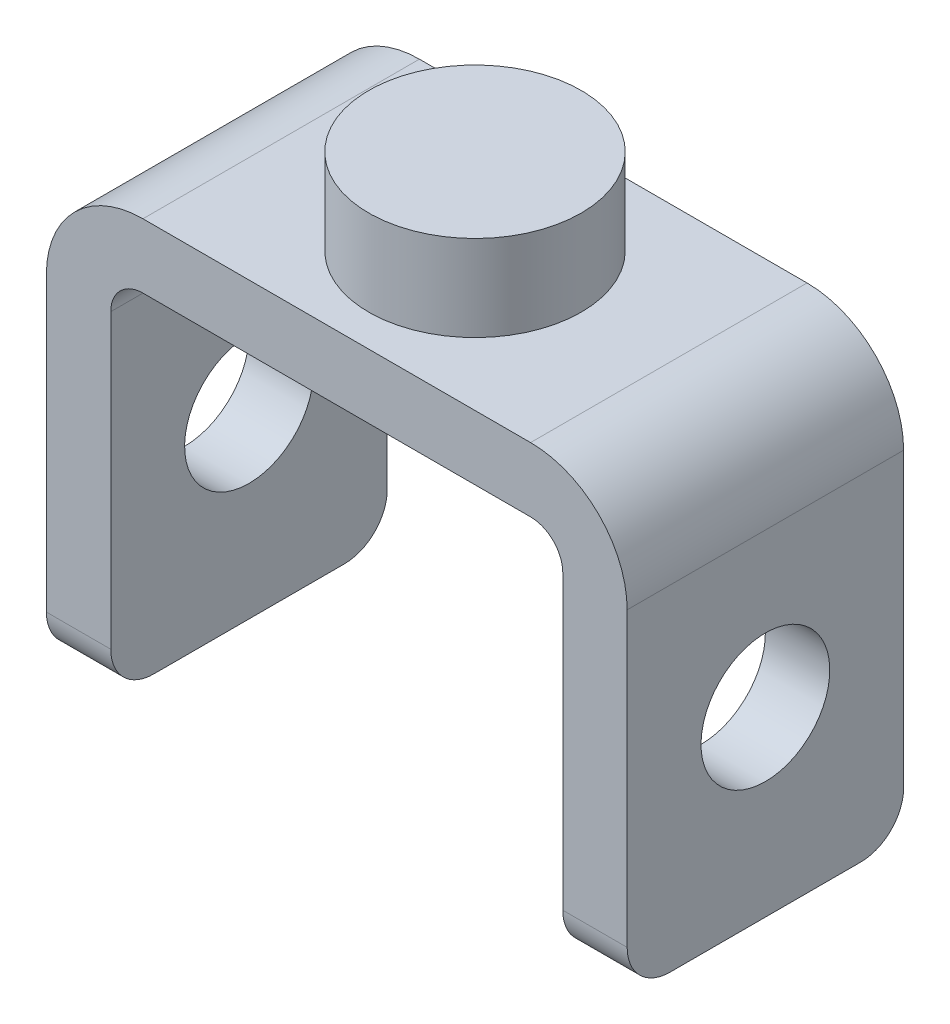
ISO-10303-21;
HEADER;
FILE_DESCRIPTION(('STEP AP214'),'2;1');
FILE_NAME('part.step','',(''),(''),'','','');
FILE_SCHEMA(('AUTOMOTIVE_DESIGN { 1 0 10303 214 1 1 1 1 }'));
ENDSEC;
DATA;
#1=APPLICATION_CONTEXT('core data for automotive mechanical design processes');
#2=APPLICATION_PROTOCOL_DEFINITION('international standard','automotive_design',2000,#1);
#3=PRODUCT_CONTEXT('',#1,'mechanical');
#4=PRODUCT('Part','Part','',(#3));
#5=PRODUCT_RELATED_PRODUCT_CATEGORY('part','',(#4));
#6=PRODUCT_DEFINITION_FORMATION('','',#4);
#7=PRODUCT_DEFINITION_CONTEXT('part definition',#1,'design');
#8=PRODUCT_DEFINITION('design','',#6,#7);
#9=PRODUCT_DEFINITION_SHAPE('','',#8);
#10=(LENGTH_UNIT() NAMED_UNIT(*) SI_UNIT(.MILLI.,.METRE.));
#11=(NAMED_UNIT(*) PLANE_ANGLE_UNIT() SI_UNIT($,.RADIAN.));
#12=(NAMED_UNIT(*) SI_UNIT($,.STERADIAN.) SOLID_ANGLE_UNIT());
#13=UNCERTAINTY_MEASURE_WITH_UNIT(LENGTH_MEASURE(1.E-05),#10,'distance_accuracy_value','');
#14=(GEOMETRIC_REPRESENTATION_CONTEXT(3) GLOBAL_UNCERTAINTY_ASSIGNED_CONTEXT((#13)) GLOBAL_UNIT_ASSIGNED_CONTEXT((#10,
#11,#12)) REPRESENTATION_CONTEXT('',''));
#15=CARTESIAN_POINT('',(0.,0.,0.));
#16=DIRECTION('',(0.,0.,1.));
#17=DIRECTION('',(1.,0.,0.));
#18=AXIS2_PLACEMENT_3D('',#15,#16,#17);
#19=CARTESIAN_POINT('',(689.030871634325,555.34088748101,-81.8077030001191));
#20=DIRECTION('',(0.,1.,0.));
#21=DIRECTION('',(0.,0.,1.));
#22=AXIS2_PLACEMENT_3D('',#19,#20,#21);
#23=PLANE('',#22);
#24=CARTESIAN_POINT('',(689.030871634325,555.34088748101,-81.8077030001191));
#25=DIRECTION('',(0.,-1.,0.));
#26=DIRECTION('',(1.,0.,0.));
#27=AXIS2_PLACEMENT_3D('',#24,#25,#26);
#28=CIRCLE('',#27,62.8792399580919);
#29=CARTESIAN_POINT('',(751.910111592417,555.34088748101,-81.8077030001191));
#30=VERTEX_POINT('',#29);
#31=EDGE_CURVE('E19',#30,#30,#28,.T.);
#32=ORIENTED_EDGE('',*,*,#31,.F.);
#33=EDGE_LOOP('',(#32));
#34=FACE_BOUND('',#33,.T.);
#35=ADVANCED_FACE('F16',(#34),#23,.T.);
#36=CARTESIAN_POINT('',(689.030871634325,555.34088748101,-81.8077030001191));
#37=DIRECTION('',(0.,-1.,0.));
#38=DIRECTION('',(1.,0.,0.));
#39=AXIS2_PLACEMENT_3D('',#36,#37,#38);
#40=CYLINDRICAL_SURFACE('',#39,62.8792399580919);
#41=ORIENTED_EDGE('',*,*,#31,.T.);
#42=EDGE_LOOP('',(#41));
#43=FACE_BOUND('',#42,.T.);
#44=CARTESIAN_POINT('',(689.030871634325,504.54088748101,-81.8077030001191));
#45=DIRECTION('',(0.,-1.,0.));
#46=DIRECTION('',(1.,0.,0.));
#47=AXIS2_PLACEMENT_3D('',#44,#45,#46);
#48=CIRCLE('',#47,62.8792399580919);
#49=CARTESIAN_POINT('',(751.910111592417,504.54088748101,-81.8077030001191));
#50=VERTEX_POINT('',#49);
#51=EDGE_CURVE('E218',#50,#50,#48,.T.);
#52=ORIENTED_EDGE('',*,*,#51,.F.);
#53=EDGE_LOOP('',(#52));
#54=FACE_BOUND('',#53,.T.);
#55=ADVANCED_FACE('F238',(#43,#54),#40,.T.);
#56=CARTESIAN_POINT('',(860.886693350958,356.550485023665,-81.8077030001191));
#57=DIRECTION('',(-1.,0.,0.));
#58=DIRECTION('',(0.,-1.,0.));
#59=AXIS2_PLACEMENT_3D('',#56,#57,#58);
#60=CYLINDRICAL_SURFACE('',#59,38.1);
#61=CARTESIAN_POINT('',(555.275049917692,356.550485023665,-81.8077030001191));
#62=DIRECTION('',(-1.,0.,0.));
#63=DIRECTION('',(0.,-1.,0.));
#64=AXIS2_PLACEMENT_3D('',#61,#62,#63);
#65=CIRCLE('',#64,38.1);
#66=CARTESIAN_POINT('',(555.275049917692,318.450485023665,-81.8077030001191));
#67=VERTEX_POINT('',#66);
#68=EDGE_CURVE('E137',#67,#67,#65,.T.);
#69=ORIENTED_EDGE('',*,*,#68,.F.);
#70=EDGE_LOOP('',(#69));
#71=FACE_BOUND('',#70,.T.);
#72=CARTESIAN_POINT('',(517.175049917692,356.550485023665,-81.8077030001191));
#73=DIRECTION('',(-1.,0.,0.));
#74=DIRECTION('',(0.,-1.,0.));
#75=AXIS2_PLACEMENT_3D('',#72,#73,#74);
#76=CIRCLE('',#75,38.1);
#77=CARTESIAN_POINT('',(517.175049917692,318.450485023665,-81.8077030001191));
#78=VERTEX_POINT('',#77);
#79=EDGE_CURVE('E211',#78,#78,#76,.F.);
#80=ORIENTED_EDGE('',*,*,#79,.F.);
#81=EDGE_LOOP('',(#80));
#82=FACE_BOUND('',#81,.T.);
#83=ADVANCED_FACE('F234',(#71,#82),#60,.F.);
#84=CARTESIAN_POINT('',(555.275049917692,248.988122651685,-163.615406000238));
#85=DIRECTION('',(0.,-1.,0.));
#86=DIRECTION('',(0.,0.,-1.));
#87=AXIS2_PLACEMENT_3D('',#84,#85,#86);
#88=PLANE('',#87);
#89=DIRECTION('',(-1.,0.,0.));
#90=VECTOR('',#89,1.);
#91=CARTESIAN_POINT('',(622.152960776008,248.988122651685,-25.4));
#92=LINE('',#91,#90);
#93=CARTESIAN_POINT('',(517.175049917692,248.988122651685,-25.4));
#94=VERTEX_POINT('',#93);
#95=CARTESIAN_POINT('',(555.275049917692,248.988122651685,-25.4));
#96=VERTEX_POINT('',#95);
#97=EDGE_CURVE('E133',#94,#96,#92,.F.);
#98=ORIENTED_EDGE('',*,*,#97,.F.);
#99=DIRECTION('',(0.,0.,1.));
#100=VECTOR('',#99,1.);
#101=CARTESIAN_POINT('',(517.175049917692,248.988122651685,-163.615406000238));
#102=LINE('',#101,#100);
#103=CARTESIAN_POINT('',(517.175049917692,248.988122651685,-138.215406000238));
#104=VERTEX_POINT('',#103);
#105=EDGE_CURVE('E217',#104,#94,#102,.T.);
#106=ORIENTED_EDGE('',*,*,#105,.F.);
#107=DIRECTION('',(1.,0.,0.));
#108=VECTOR('',#107,1.);
#109=CARTESIAN_POINT('',(622.152960776008,248.988122651685,-138.215406000238));
#110=LINE('',#109,#108);
#111=CARTESIAN_POINT('',(555.275049917692,248.988122651685,-138.215406000238));
#112=VERTEX_POINT('',#111);
#113=EDGE_CURVE('E171',#112,#104,#110,.F.);
#114=ORIENTED_EDGE('',*,*,#113,.F.);
#115=DIRECTION('',(0.,0.,-1.));
#116=VECTOR('',#115,1.);
#117=CARTESIAN_POINT('',(555.275049917692,248.988122651685,-163.615406000238));
#118=LINE('',#117,#116);
#119=EDGE_CURVE('E136',#96,#112,#118,.T.);
#120=ORIENTED_EDGE('',*,*,#119,.F.);
#121=EDGE_LOOP('',(#98,#106,#114,#120));
#122=FACE_BOUND('',#121,.T.);
#123=ADVANCED_FACE('F237',(#122),#88,.T.);
#124=CARTESIAN_POINT('',(860.886693350958,248.988122651685,-163.615406000238));
#125=DIRECTION('',(0.,-1.,0.));
#126=DIRECTION('',(0.,0.,-1.));
#127=AXIS2_PLACEMENT_3D('',#124,#125,#126);
#128=PLANE('',#127);
#129=DIRECTION('',(-1.,0.,0.));
#130=VECTOR('',#129,1.);
#131=CARTESIAN_POINT('',(774.958782492641,248.988122651685,-25.4));
#132=LINE('',#131,#130);
#133=CARTESIAN_POINT('',(822.786693350958,248.988122651685,-25.4));
#134=VERTEX_POINT('',#133);
#135=CARTESIAN_POINT('',(860.886693350958,248.988122651685,-25.4));
#136=VERTEX_POINT('',#135);
#137=EDGE_CURVE('E166',#134,#136,#132,.F.);
#138=ORIENTED_EDGE('',*,*,#137,.F.);
#139=DIRECTION('',(0.,0.,1.));
#140=VECTOR('',#139,1.);
#141=CARTESIAN_POINT('',(822.786693350958,248.988122651685,-163.615406000238));
#142=LINE('',#141,#140);
#143=CARTESIAN_POINT('',(822.786693350958,248.988122651685,-138.215406000238));
#144=VERTEX_POINT('',#143);
#145=EDGE_CURVE('E203',#144,#134,#142,.T.);
#146=ORIENTED_EDGE('',*,*,#145,.F.);
#147=DIRECTION('',(1.,0.,0.));
#148=VECTOR('',#147,1.);
#149=CARTESIAN_POINT('',(774.958782492641,248.988122651685,-138.215406000238));
#150=LINE('',#149,#148);
#151=CARTESIAN_POINT('',(860.886693350958,248.988122651685,-138.215406000238));
#152=VERTEX_POINT('',#151);
#153=EDGE_CURVE('E168',#152,#144,#150,.F.);
#154=ORIENTED_EDGE('',*,*,#153,.F.);
#155=DIRECTION('',(0.,0.,-1.));
#156=VECTOR('',#155,1.);
#157=CARTESIAN_POINT('',(860.886693350958,248.988122651685,-163.615406000238));
#158=LINE('',#157,#156);
#159=EDGE_CURVE('E226',#136,#152,#158,.T.);
#160=ORIENTED_EDGE('',*,*,#159,.F.);
#161=EDGE_LOOP('',(#138,#146,#154,#160));
#162=FACE_BOUND('',#161,.T.);
#163=ADVANCED_FACE('F360',(#162),#128,.T.);
#164=CARTESIAN_POINT('',(860.886693350958,356.550485023665,-81.8077030001191));
#165=DIRECTION('',(-1.,0.,0.));
#166=DIRECTION('',(0.,-1.,0.));
#167=AXIS2_PLACEMENT_3D('',#164,#165,#166);
#168=CYLINDRICAL_SURFACE('',#167,38.1);
#169=CARTESIAN_POINT('',(860.886693350958,356.550485023665,-81.8077030001191));
#170=DIRECTION('',(-1.,0.,0.));
#171=DIRECTION('',(0.,-1.,0.));
#172=AXIS2_PLACEMENT_3D('',#169,#170,#171);
#173=CIRCLE('',#172,38.1);
#174=CARTESIAN_POINT('',(860.886693350958,318.450485023665,-81.8077030001191));
#175=VERTEX_POINT('',#174);
#176=EDGE_CURVE('E170',#175,#175,#173,.T.);
#177=ORIENTED_EDGE('',*,*,#176,.F.);
#178=EDGE_LOOP('',(#177));
#179=FACE_BOUND('',#178,.T.);
#180=CARTESIAN_POINT('',(822.786693350958,356.550485023665,-81.8077030001191));
#181=DIRECTION('',(-1.,0.,0.));
#182=DIRECTION('',(0.,-1.,0.));
#183=AXIS2_PLACEMENT_3D('',#180,#181,#182);
#184=CIRCLE('',#183,38.1);
#185=CARTESIAN_POINT('',(822.786693350958,318.450485023665,-81.8077030001191));
#186=VERTEX_POINT('',#185);
#187=EDGE_CURVE('E154',#186,#186,#184,.F.);
#188=ORIENTED_EDGE('',*,*,#187,.F.);
#189=EDGE_LOOP('',(#188));
#190=FACE_BOUND('',#189,.T.);
#191=ADVANCED_FACE('F365',(#179,#190),#168,.F.);
#192=CARTESIAN_POINT('',(622.152960776008,274.388122651685,-25.4));
#193=DIRECTION('',(-1.,0.,0.));
#194=DIRECTION('',(0.,0.,1.));
#195=AXIS2_PLACEMENT_3D('',#192,#193,#194);
#196=CYLINDRICAL_SURFACE('',#195,25.4);
#197=CARTESIAN_POINT('',(555.275049917692,274.388122651685,-25.4));
#198=DIRECTION('',(-1.,0.,0.));
#199=DIRECTION('',(0.,0.,1.));
#200=AXIS2_PLACEMENT_3D('',#197,#198,#199);
#201=CIRCLE('',#200,25.4);
#202=CARTESIAN_POINT('',(555.275049917692,274.388122651685,0.));
#203=VERTEX_POINT('',#202);
#204=EDGE_CURVE('E126',#203,#96,#201,.F.);
#205=ORIENTED_EDGE('',*,*,#204,.F.);
#206=DIRECTION('',(1.,0.,0.));
#207=VECTOR('',#206,1.);
#208=CARTESIAN_POINT('',(689.030871634325,274.388122651685,0.));
#209=LINE('',#208,#207);
#210=CARTESIAN_POINT('',(517.175049917692,274.388122651685,0.));
#211=VERTEX_POINT('',#210);
#212=EDGE_CURVE('E131',#211,#203,#209,.T.);
#213=ORIENTED_EDGE('',*,*,#212,.F.);
#214=CARTESIAN_POINT('',(517.175049917692,274.388122651685,-25.4));
#215=DIRECTION('',(-1.,0.,0.));
#216=DIRECTION('',(0.,0.,1.));
#217=AXIS2_PLACEMENT_3D('',#214,#215,#216);
#218=CIRCLE('',#217,25.4);
#219=EDGE_CURVE('E215',#94,#211,#218,.T.);
#220=ORIENTED_EDGE('',*,*,#219,.F.);
#221=ORIENTED_EDGE('',*,*,#97,.T.);
#222=EDGE_LOOP('',(#205,#213,#220,#221));
#223=FACE_BOUND('',#222,.T.);
#224=ADVANCED_FACE('F128',(#223),#196,.T.);
#225=CARTESIAN_POINT('',(774.958782492641,274.388122651685,-25.4));
#226=DIRECTION('',(-1.,0.,0.));
#227=DIRECTION('',(0.,0.,1.));
#228=AXIS2_PLACEMENT_3D('',#225,#226,#227);
#229=CYLINDRICAL_SURFACE('',#228,25.4);
#230=CARTESIAN_POINT('',(822.786693350958,274.388122651685,-25.4));
#231=DIRECTION('',(-1.,0.,0.));
#232=DIRECTION('',(0.,0.,1.));
#233=AXIS2_PLACEMENT_3D('',#230,#231,#232);
#234=CIRCLE('',#233,25.4);
#235=CARTESIAN_POINT('',(822.786693350958,274.388122651685,0.));
#236=VERTEX_POINT('',#235);
#237=EDGE_CURVE('E157',#134,#236,#234,.T.);
#238=ORIENTED_EDGE('',*,*,#237,.F.);
#239=ORIENTED_EDGE('',*,*,#137,.T.);
#240=CARTESIAN_POINT('',(860.886693350958,274.388122651685,-25.4));
#241=DIRECTION('',(-1.,0.,0.));
#242=DIRECTION('',(0.,0.,1.));
#243=AXIS2_PLACEMENT_3D('',#240,#241,#242);
#244=CIRCLE('',#243,25.4);
#245=CARTESIAN_POINT('',(860.886693350958,274.388122651685,0.));
#246=VERTEX_POINT('',#245);
#247=EDGE_CURVE('E223',#246,#136,#244,.F.);
#248=ORIENTED_EDGE('',*,*,#247,.F.);
#249=DIRECTION('',(1.,0.,0.));
#250=VECTOR('',#249,1.);
#251=CARTESIAN_POINT('',(689.030871634325,274.388122651685,0.));
#252=LINE('',#251,#250);
#253=EDGE_CURVE('E162',#236,#246,#252,.T.);
#254=ORIENTED_EDGE('',*,*,#253,.F.);
#255=EDGE_LOOP('',(#238,#239,#248,#254));
#256=FACE_BOUND('',#255,.T.);
#257=ADVANCED_FACE('F316',(#256),#229,.T.);
#258=CARTESIAN_POINT('',(555.275049917692,447.39088748101,-163.615406000238));
#259=DIRECTION('',(1.,0.,0.));
#260=DIRECTION('',(0.,0.,-1.));
#261=AXIS2_PLACEMENT_3D('',#258,#259,#260);
#262=PLANE('',#261);
#263=ORIENTED_EDGE('',*,*,#204,.T.);
#264=ORIENTED_EDGE('',*,*,#119,.T.);
#265=CARTESIAN_POINT('',(555.275049917692,274.388122651685,-138.215406000238));
#266=DIRECTION('',(1.,0.,0.));
#267=DIRECTION('',(0.,0.,-1.));
#268=AXIS2_PLACEMENT_3D('',#265,#266,#267);
#269=CIRCLE('',#268,25.4);
#270=CARTESIAN_POINT('',(555.275049917692,274.388122651685,-163.615406000238));
#271=VERTEX_POINT('',#270);
#272=EDGE_CURVE('E175',#271,#112,#269,.F.);
#273=ORIENTED_EDGE('',*,*,#272,.F.);
#274=DIRECTION('',(0.,1.,0.));
#275=VECTOR('',#274,1.);
#276=CARTESIAN_POINT('',(555.275049917692,403.21964238776,-163.615406000238));
#277=LINE('',#276,#275);
#278=CARTESIAN_POINT('',(555.275049917692,447.39088748101,-163.615406000238));
#279=VERTEX_POINT('',#278);
#280=EDGE_CURVE('E193',#271,#279,#277,.T.);
#281=ORIENTED_EDGE('',*,*,#280,.T.);
#282=DIRECTION('',(0.,0.,1.));
#283=VECTOR('',#282,1.);
#284=CARTESIAN_POINT('',(555.275049917692,447.39088748101,-163.615406000238));
#285=LINE('',#284,#283);
#286=CARTESIAN_POINT('',(555.275049917692,447.39088748101,0.));
#287=VERTEX_POINT('',#286);
#288=EDGE_CURVE('E144',#287,#279,#285,.F.);
#289=ORIENTED_EDGE('',*,*,#288,.F.);
#290=DIRECTION('',(0.,1.,0.));
#291=VECTOR('',#290,1.);
#292=CARTESIAN_POINT('',(555.275049917692,403.21964238776,0.));
#293=LINE('',#292,#291);
#294=EDGE_CURVE('E140',#203,#287,#293,.T.);
#295=ORIENTED_EDGE('',*,*,#294,.F.);
#296=EDGE_LOOP('',(#263,#264,#273,#281,#289,#295));
#297=FACE_BOUND('',#296,.T.);
#298=ORIENTED_EDGE('',*,*,#68,.T.);
#299=EDGE_LOOP('',(#298));
#300=FACE_BOUND('',#299,.T.);
#301=ADVANCED_FACE('F141',(#297,#300),#262,.T.);
#302=CARTESIAN_POINT('',(774.958782492641,274.388122651685,-138.215406000238));
#303=DIRECTION('',(1.,0.,0.));
#304=DIRECTION('',(0.,0.,-1.));
#305=AXIS2_PLACEMENT_3D('',#302,#303,#304);
#306=CYLINDRICAL_SURFACE('',#305,25.4);
#307=CARTESIAN_POINT('',(822.786693350958,274.388122651685,-138.215406000238));
#308=DIRECTION('',(1.,0.,0.));
#309=DIRECTION('',(0.,0.,-1.));
#310=AXIS2_PLACEMENT_3D('',#307,#308,#309);
#311=CIRCLE('',#310,25.4);
#312=CARTESIAN_POINT('',(822.786693350958,274.388122651685,-163.615406000238));
#313=VERTEX_POINT('',#312);
#314=EDGE_CURVE('E174',#313,#144,#311,.F.);
#315=ORIENTED_EDGE('',*,*,#314,.F.);
#316=DIRECTION('',(1.,0.,0.));
#317=VECTOR('',#316,1.);
#318=CARTESIAN_POINT('',(689.030871634325,274.388122651685,-163.615406000238));
#319=LINE('',#318,#317);
#320=CARTESIAN_POINT('',(860.886693350958,274.388122651685,-163.615406000238));
#321=VERTEX_POINT('',#320);
#322=EDGE_CURVE('E265',#313,#321,#319,.T.);
#323=ORIENTED_EDGE('',*,*,#322,.T.);
#324=CARTESIAN_POINT('',(860.886693350958,274.388122651685,-138.215406000238));
#325=DIRECTION('',(1.,0.,0.));
#326=DIRECTION('',(0.,0.,-1.));
#327=AXIS2_PLACEMENT_3D('',#324,#325,#326);
#328=CIRCLE('',#327,25.4);
#329=EDGE_CURVE('E227',#152,#321,#328,.T.);
#330=ORIENTED_EDGE('',*,*,#329,.F.);
#331=ORIENTED_EDGE('',*,*,#153,.T.);
#332=EDGE_LOOP('',(#315,#323,#330,#331));
#333=FACE_BOUND('',#332,.T.);
#334=ADVANCED_FACE('F423',(#333),#306,.T.);
#335=CARTESIAN_POINT('',(860.886693350958,447.39088748101,-163.615406000238));
#336=DIRECTION('',(1.,0.,0.));
#337=DIRECTION('',(0.,0.,-1.));
#338=AXIS2_PLACEMENT_3D('',#335,#336,#337);
#339=PLANE('',#338);
#340=ORIENTED_EDGE('',*,*,#247,.T.);
#341=ORIENTED_EDGE('',*,*,#159,.T.);
#342=ORIENTED_EDGE('',*,*,#329,.T.);
#343=DIRECTION('',(0.,1.,0.));
#344=VECTOR('',#343,1.);
#345=CARTESIAN_POINT('',(860.886693350958,403.21964238776,-163.615406000238));
#346=LINE('',#345,#344);
#347=CARTESIAN_POINT('',(860.886693350958,447.39088748101,-163.615406000238));
#348=VERTEX_POINT('',#347);
#349=EDGE_CURVE('E189',#321,#348,#346,.T.);
#350=ORIENTED_EDGE('',*,*,#349,.T.);
#351=DIRECTION('',(0.,0.,1.));
#352=VECTOR('',#351,1.);
#353=CARTESIAN_POINT('',(860.886693350958,447.39088748101,-163.615406000238));
#354=LINE('',#353,#352);
#355=CARTESIAN_POINT('',(860.886693350958,447.39088748101,0.));
#356=VERTEX_POINT('',#355);
#357=EDGE_CURVE('E294',#356,#348,#354,.F.);
#358=ORIENTED_EDGE('',*,*,#357,.F.);
#359=DIRECTION('',(0.,1.,0.));
#360=VECTOR('',#359,1.);
#361=CARTESIAN_POINT('',(860.886693350958,403.21964238776,0.));
#362=LINE('',#361,#360);
#363=EDGE_CURVE('E165',#246,#356,#362,.T.);
#364=ORIENTED_EDGE('',*,*,#363,.F.);
#365=EDGE_LOOP('',(#340,#341,#342,#350,#358,#364));
#366=FACE_BOUND('',#365,.T.);
#367=ORIENTED_EDGE('',*,*,#176,.T.);
#368=EDGE_LOOP('',(#367));
#369=FACE_BOUND('',#368,.T.);
#370=ADVANCED_FACE('F319',(#366,#369),#339,.T.);
#371=CARTESIAN_POINT('',(803.736693350958,447.39088748101,-163.615406000238));
#372=DIRECTION('',(0.,0.,1.));
#373=DIRECTION('',(1.,0.,0.));
#374=AXIS2_PLACEMENT_3D('',#371,#372,#373);
#375=CYLINDRICAL_SURFACE('',#374,57.15);
#376=CARTESIAN_POINT('',(803.736693350958,447.39088748101,-163.615406000238));
#377=DIRECTION('',(0.,0.,1.));
#378=DIRECTION('',(1.,0.,0.));
#379=AXIS2_PLACEMENT_3D('',#376,#377,#378);
#380=CIRCLE('',#379,57.15);
#381=CARTESIAN_POINT('',(803.736693350958,504.54088748101,-163.615406000238));
#382=VERTEX_POINT('',#381);
#383=EDGE_CURVE('E187',#348,#382,#380,.T.);
#384=ORIENTED_EDGE('',*,*,#383,.T.);
#385=DIRECTION('',(0.,0.,1.));
#386=VECTOR('',#385,1.);
#387=CARTESIAN_POINT('',(803.736693350958,504.54088748101,-163.615406000238));
#388=LINE('',#387,#386);
#389=CARTESIAN_POINT('',(803.736693350958,504.54088748101,0.));
#390=VERTEX_POINT('',#389);
#391=EDGE_CURVE('E222',#390,#382,#388,.F.);
#392=ORIENTED_EDGE('',*,*,#391,.F.);
#393=CARTESIAN_POINT('',(803.736693350958,447.39088748101,0.));
#394=DIRECTION('',(0.,0.,1.));
#395=DIRECTION('',(1.,0.,0.));
#396=AXIS2_PLACEMENT_3D('',#393,#394,#395);
#397=CIRCLE('',#396,57.15);
#398=EDGE_CURVE('E199',#356,#390,#397,.T.);
#399=ORIENTED_EDGE('',*,*,#398,.F.);
#400=ORIENTED_EDGE('',*,*,#357,.T.);
#401=EDGE_LOOP('',(#384,#392,#399,#400));
#402=FACE_BOUND('',#401,.T.);
#403=ADVANCED_FACE('F325',(#402),#375,.T.);
#404=CARTESIAN_POINT('',(574.325049917692,504.54088748101,-163.615406000238));
#405=DIRECTION('',(0.,1.,0.));
#406=DIRECTION('',(0.,0.,1.));
#407=AXIS2_PLACEMENT_3D('',#404,#405,#406);
#408=PLANE('',#407);
#409=ORIENTED_EDGE('',*,*,#51,.T.);
#410=EDGE_LOOP('',(#409));
#411=FACE_BOUND('',#410,.T.);
#412=DIRECTION('',(1.,0.,0.));
#413=VECTOR('',#412,1.);
#414=CARTESIAN_POINT('',(689.030871634325,504.54088748101,-163.615406000238));
#415=LINE('',#414,#413);
#416=CARTESIAN_POINT('',(574.325049917692,504.54088748101,-163.615406000238));
#417=VERTEX_POINT('',#416);
#418=EDGE_CURVE('E186',#382,#417,#415,.F.);
#419=ORIENTED_EDGE('',*,*,#418,.T.);
#420=DIRECTION('',(0.,0.,1.));
#421=VECTOR('',#420,1.);
#422=CARTESIAN_POINT('',(574.325049917692,504.54088748101,-163.615406000238));
#423=LINE('',#422,#421);
#424=CARTESIAN_POINT('',(574.325049917692,504.54088748101,0.));
#425=VERTEX_POINT('',#424);
#426=EDGE_CURVE('E221',#425,#417,#423,.F.);
#427=ORIENTED_EDGE('',*,*,#426,.F.);
#428=DIRECTION('',(1.,0.,0.));
#429=VECTOR('',#428,1.);
#430=CARTESIAN_POINT('',(689.030871634325,504.54088748101,0.));
#431=LINE('',#430,#429);
#432=EDGE_CURVE('E198',#390,#425,#431,.F.);
#433=ORIENTED_EDGE('',*,*,#432,.F.);
#434=ORIENTED_EDGE('',*,*,#391,.T.);
#435=EDGE_LOOP('',(#419,#427,#433,#434));
#436=FACE_BOUND('',#435,.T.);
#437=ADVANCED_FACE('F328',(#411,#436),#408,.T.);
#438=CARTESIAN_POINT('',(574.325049917692,447.39088748101,-163.615406000238));
#439=DIRECTION('',(0.,0.,1.));
#440=DIRECTION('',(1.,0.,0.));
#441=AXIS2_PLACEMENT_3D('',#438,#439,#440);
#442=CYLINDRICAL_SURFACE('',#441,57.15);
#443=CARTESIAN_POINT('',(574.325049917692,447.39088748101,-163.615406000238));
#444=DIRECTION('',(0.,0.,1.));
#445=DIRECTION('',(1.,0.,0.));
#446=AXIS2_PLACEMENT_3D('',#443,#444,#445);
#447=CIRCLE('',#446,57.15);
#448=CARTESIAN_POINT('',(517.175049917692,447.39088748101,-163.615406000238));
#449=VERTEX_POINT('',#448);
#450=EDGE_CURVE('E183',#417,#449,#447,.T.);
#451=ORIENTED_EDGE('',*,*,#450,.T.);
#452=DIRECTION('',(0.,0.,1.));
#453=VECTOR('',#452,1.);
#454=CARTESIAN_POINT('',(517.175049917692,447.39088748101,-163.615406000238));
#455=LINE('',#454,#453);
#456=CARTESIAN_POINT('',(517.175049917692,447.39088748101,0.));
#457=VERTEX_POINT('',#456);
#458=EDGE_CURVE('E214',#457,#449,#455,.F.);
#459=ORIENTED_EDGE('',*,*,#458,.F.);
#460=CARTESIAN_POINT('',(574.325049917692,447.39088748101,0.));
#461=DIRECTION('',(0.,0.,1.));
#462=DIRECTION('',(1.,0.,0.));
#463=AXIS2_PLACEMENT_3D('',#460,#461,#462);
#464=CIRCLE('',#463,57.15);
#465=EDGE_CURVE('E196',#425,#457,#464,.T.);
#466=ORIENTED_EDGE('',*,*,#465,.F.);
#467=ORIENTED_EDGE('',*,*,#426,.T.);
#468=EDGE_LOOP('',(#451,#459,#466,#467));
#469=FACE_BOUND('',#468,.T.);
#470=ADVANCED_FACE('F246',(#469),#442,.T.);
#471=CARTESIAN_POINT('',(517.175049917692,248.988122651685,-163.615406000238));
#472=DIRECTION('',(-1.,0.,0.));
#473=DIRECTION('',(0.,0.,1.));
#474=AXIS2_PLACEMENT_3D('',#471,#472,#473);
#475=PLANE('',#474);
#476=ORIENTED_EDGE('',*,*,#79,.T.);
#477=EDGE_LOOP('',(#476));
#478=FACE_BOUND('',#477,.T.);
#479=ORIENTED_EDGE('',*,*,#458,.T.);
#480=DIRECTION('',(0.,1.,0.));
#481=VECTOR('',#480,1.);
#482=CARTESIAN_POINT('',(517.175049917692,403.21964238776,-163.615406000238));
#483=LINE('',#482,#481);
#484=CARTESIAN_POINT('',(517.175049917692,274.388122651685,-163.615406000238));
#485=VERTEX_POINT('',#484);
#486=EDGE_CURVE('E185',#449,#485,#483,.F.);
#487=ORIENTED_EDGE('',*,*,#486,.T.);
#488=CARTESIAN_POINT('',(517.175049917692,274.388122651685,-138.215406000238));
#489=DIRECTION('',(1.,0.,0.));
#490=DIRECTION('',(0.,0.,-1.));
#491=AXIS2_PLACEMENT_3D('',#488,#489,#490);
#492=CIRCLE('',#491,25.4);
#493=EDGE_CURVE('E208',#104,#485,#492,.T.);
#494=ORIENTED_EDGE('',*,*,#493,.F.);
#495=ORIENTED_EDGE('',*,*,#105,.T.);
#496=ORIENTED_EDGE('',*,*,#219,.T.);
#497=DIRECTION('',(0.,1.,0.));
#498=VECTOR('',#497,1.);
#499=CARTESIAN_POINT('',(517.175049917692,403.21964238776,0.));
#500=LINE('',#499,#498);
#501=EDGE_CURVE('E153',#457,#211,#500,.F.);
#502=ORIENTED_EDGE('',*,*,#501,.F.);
#503=EDGE_LOOP('',(#479,#487,#494,#495,#496,#502));
#504=FACE_BOUND('',#503,.T.);
#505=ADVANCED_FACE('F242',(#478,#504),#475,.T.);
#506=CARTESIAN_POINT('',(622.152960776008,274.388122651685,-138.215406000238));
#507=DIRECTION('',(1.,0.,0.));
#508=DIRECTION('',(0.,0.,-1.));
#509=AXIS2_PLACEMENT_3D('',#506,#507,#508);
#510=CYLINDRICAL_SURFACE('',#509,25.4);
#511=ORIENTED_EDGE('',*,*,#272,.T.);
#512=ORIENTED_EDGE('',*,*,#113,.T.);
#513=ORIENTED_EDGE('',*,*,#493,.T.);
#514=DIRECTION('',(1.,0.,0.));
#515=VECTOR('',#514,1.);
#516=CARTESIAN_POINT('',(689.030871634325,274.388122651685,-163.615406000238));
#517=LINE('',#516,#515);
#518=EDGE_CURVE('E182',#485,#271,#517,.T.);
#519=ORIENTED_EDGE('',*,*,#518,.T.);
#520=EDGE_LOOP('',(#511,#512,#513,#519));
#521=FACE_BOUND('',#520,.T.);
#522=ADVANCED_FACE('F245',(#521),#510,.T.);
#523=CARTESIAN_POINT('',(822.786693350958,248.988122651685,-163.615406000238));
#524=DIRECTION('',(-1.,0.,0.));
#525=DIRECTION('',(0.,0.,1.));
#526=AXIS2_PLACEMENT_3D('',#523,#524,#525);
#527=PLANE('',#526);
#528=ORIENTED_EDGE('',*,*,#187,.T.);
#529=EDGE_LOOP('',(#528));
#530=FACE_BOUND('',#529,.T.);
#531=DIRECTION('',(0.,0.,1.));
#532=VECTOR('',#531,1.);
#533=CARTESIAN_POINT('',(822.786693350958,447.39088748101,-163.615406000238));
#534=LINE('',#533,#532);
#535=CARTESIAN_POINT('',(822.786693350958,447.39088748101,-163.615406000238));
#536=VERTEX_POINT('',#535);
#537=CARTESIAN_POINT('',(822.786693350958,447.39088748101,0.));
#538=VERTEX_POINT('',#537);
#539=EDGE_CURVE('E178',#536,#538,#534,.T.);
#540=ORIENTED_EDGE('',*,*,#539,.F.);
#541=DIRECTION('',(0.,1.,0.));
#542=VECTOR('',#541,1.);
#543=CARTESIAN_POINT('',(822.786693350958,403.21964238776,-163.615406000238));
#544=LINE('',#543,#542);
#545=EDGE_CURVE('E192',#536,#313,#544,.F.);
#546=ORIENTED_EDGE('',*,*,#545,.T.);
#547=ORIENTED_EDGE('',*,*,#314,.T.);
#548=ORIENTED_EDGE('',*,*,#145,.T.);
#549=ORIENTED_EDGE('',*,*,#237,.T.);
#550=DIRECTION('',(0.,1.,0.));
#551=VECTOR('',#550,1.);
#552=CARTESIAN_POINT('',(822.786693350958,403.21964238776,0.));
#553=LINE('',#552,#551);
#554=EDGE_CURVE('E147',#538,#236,#553,.F.);
#555=ORIENTED_EDGE('',*,*,#554,.F.);
#556=EDGE_LOOP('',(#540,#546,#547,#548,#549,#555));
#557=FACE_BOUND('',#556,.T.);
#558=ADVANCED_FACE('F310',(#530,#557),#527,.T.);
#559=CARTESIAN_POINT('',(689.030871634325,403.21964238776,0.));
#560=DIRECTION('',(0.,0.,1.));
#561=DIRECTION('',(1.,0.,0.));
#562=AXIS2_PLACEMENT_3D('',#559,#560,#561);
#563=PLANE('',#562);
#564=ORIENTED_EDGE('',*,*,#465,.T.);
#565=ORIENTED_EDGE('',*,*,#501,.T.);
#566=ORIENTED_EDGE('',*,*,#212,.T.);
#567=ORIENTED_EDGE('',*,*,#294,.T.);
#568=CARTESIAN_POINT('',(574.325049917692,447.39088748101,0.));
#569=DIRECTION('',(0.,0.,1.));
#570=DIRECTION('',(1.,0.,0.));
#571=AXIS2_PLACEMENT_3D('',#568,#569,#570);
#572=CIRCLE('',#571,19.05);
#573=CARTESIAN_POINT('',(574.325049917692,466.44088748101,0.));
#574=VERTEX_POINT('',#573);
#575=EDGE_CURVE('E194',#574,#287,#572,.T.);
#576=ORIENTED_EDGE('',*,*,#575,.F.);
#577=DIRECTION('',(1.,0.,0.));
#578=VECTOR('',#577,1.);
#579=CARTESIAN_POINT('',(803.736693350958,466.44088748101,0.));
#580=LINE('',#579,#578);
#581=CARTESIAN_POINT('',(803.736693350958,466.44088748101,0.));
#582=VERTEX_POINT('',#581);
#583=EDGE_CURVE('E272',#582,#574,#580,.F.);
#584=ORIENTED_EDGE('',*,*,#583,.F.);
#585=CARTESIAN_POINT('',(803.736693350958,447.39088748101,0.));
#586=DIRECTION('',(0.,0.,1.));
#587=DIRECTION('',(1.,0.,0.));
#588=AXIS2_PLACEMENT_3D('',#585,#586,#587);
#589=CIRCLE('',#588,19.05);
#590=EDGE_CURVE('E179',#538,#582,#589,.T.);
#591=ORIENTED_EDGE('',*,*,#590,.F.);
#592=ORIENTED_EDGE('',*,*,#554,.T.);
#593=ORIENTED_EDGE('',*,*,#253,.T.);
#594=ORIENTED_EDGE('',*,*,#363,.T.);
#595=ORIENTED_EDGE('',*,*,#398,.T.);
#596=ORIENTED_EDGE('',*,*,#432,.T.);
#597=EDGE_LOOP('',(#564,#565,#566,#567,#576,#584,#591,#592,#593,#594,#595,#596));
#598=FACE_BOUND('',#597,.T.);
#599=ADVANCED_FACE('F151',(#598),#563,.T.);
#600=CARTESIAN_POINT('',(574.325049917692,447.39088748101,-163.615406000238));
#601=DIRECTION('',(0.,0.,1.));
#602=DIRECTION('',(1.,0.,0.));
#603=AXIS2_PLACEMENT_3D('',#600,#601,#602);
#604=CYLINDRICAL_SURFACE('',#603,19.05);
#605=CARTESIAN_POINT('',(574.325049917692,447.39088748101,-163.615406000238));
#606=DIRECTION('',(0.,0.,1.));
#607=DIRECTION('',(1.,0.,0.));
#608=AXIS2_PLACEMENT_3D('',#605,#606,#607);
#609=CIRCLE('',#608,19.05);
#610=CARTESIAN_POINT('',(574.325049917692,466.44088748101,-163.615406000238));
#611=VERTEX_POINT('',#610);
#612=EDGE_CURVE('E190',#279,#611,#609,.F.);
#613=ORIENTED_EDGE('',*,*,#612,.T.);
#614=DIRECTION('',(0.,0.,1.));
#615=VECTOR('',#614,1.);
#616=CARTESIAN_POINT('',(574.325049917692,466.44088748101,-163.615406000238));
#617=LINE('',#616,#615);
#618=EDGE_CURVE('E269',#574,#611,#617,.F.);
#619=ORIENTED_EDGE('',*,*,#618,.F.);
#620=ORIENTED_EDGE('',*,*,#575,.T.);
#621=ORIENTED_EDGE('',*,*,#288,.T.);
#622=EDGE_LOOP('',(#613,#619,#620,#621));
#623=FACE_BOUND('',#622,.T.);
#624=ADVANCED_FACE('F301',(#623),#604,.F.);
#625=CARTESIAN_POINT('',(689.030871634325,403.21964238776,-163.615406000238));
#626=DIRECTION('',(0.,0.,1.));
#627=DIRECTION('',(1.,0.,0.));
#628=AXIS2_PLACEMENT_3D('',#625,#626,#627);
#629=PLANE('',#628);
#630=ORIENTED_EDGE('',*,*,#486,.F.);
#631=ORIENTED_EDGE('',*,*,#450,.F.);
#632=ORIENTED_EDGE('',*,*,#418,.F.);
#633=ORIENTED_EDGE('',*,*,#383,.F.);
#634=ORIENTED_EDGE('',*,*,#349,.F.);
#635=ORIENTED_EDGE('',*,*,#322,.F.);
#636=ORIENTED_EDGE('',*,*,#545,.F.);
#637=CARTESIAN_POINT('',(803.736693350958,447.39088748101,-163.615406000238));
#638=DIRECTION('',(0.,0.,1.));
#639=DIRECTION('',(1.,0.,0.));
#640=AXIS2_PLACEMENT_3D('',#637,#638,#639);
#641=CIRCLE('',#640,19.05);
#642=CARTESIAN_POINT('',(803.736693350958,466.44088748101,-163.615406000238));
#643=VERTEX_POINT('',#642);
#644=EDGE_CURVE('E34',#643,#536,#641,.F.);
#645=ORIENTED_EDGE('',*,*,#644,.F.);
#646=DIRECTION('',(1.,0.,0.));
#647=VECTOR('',#646,1.);
#648=CARTESIAN_POINT('',(803.736693350958,466.44088748101,-163.615406000238));
#649=LINE('',#648,#647);
#650=EDGE_CURVE('E25',#611,#643,#649,.T.);
#651=ORIENTED_EDGE('',*,*,#650,.F.);
#652=ORIENTED_EDGE('',*,*,#612,.F.);
#653=ORIENTED_EDGE('',*,*,#280,.F.);
#654=ORIENTED_EDGE('',*,*,#518,.F.);
#655=EDGE_LOOP('',(#630,#631,#632,#633,#634,#635,#636,#645,#651,#652,#653,#654));
#656=FACE_BOUND('',#655,.T.);
#657=ADVANCED_FACE('F256',(#656),#629,.F.);
#658=CARTESIAN_POINT('',(803.736693350958,447.39088748101,-163.615406000238));
#659=DIRECTION('',(0.,0.,1.));
#660=DIRECTION('',(1.,0.,0.));
#661=AXIS2_PLACEMENT_3D('',#658,#659,#660);
#662=CYLINDRICAL_SURFACE('',#661,19.05);
#663=ORIENTED_EDGE('',*,*,#644,.T.);
#664=ORIENTED_EDGE('',*,*,#539,.T.);
#665=ORIENTED_EDGE('',*,*,#590,.T.);
#666=DIRECTION('',(0.,0.,1.));
#667=VECTOR('',#666,1.);
#668=CARTESIAN_POINT('',(803.736693350958,466.44088748101,-163.615406000238));
#669=LINE('',#668,#667);
#670=EDGE_CURVE('E11',#643,#582,#669,.T.);
#671=ORIENTED_EDGE('',*,*,#670,.F.);
#672=EDGE_LOOP('',(#663,#664,#665,#671));
#673=FACE_BOUND('',#672,.T.);
#674=ADVANCED_FACE('F307',(#673),#662,.F.);
#675=CARTESIAN_POINT('',(803.736693350958,466.44088748101,-163.615406000238));
#676=DIRECTION('',(0.,-1.,0.));
#677=DIRECTION('',(1.,0.,0.));
#678=AXIS2_PLACEMENT_3D('',#675,#676,#677);
#679=PLANE('',#678);
#680=ORIENTED_EDGE('',*,*,#650,.T.);
#681=ORIENTED_EDGE('',*,*,#670,.T.);
#682=ORIENTED_EDGE('',*,*,#583,.T.);
#683=ORIENTED_EDGE('',*,*,#618,.T.);
#684=EDGE_LOOP('',(#680,#681,#682,#683));
#685=FACE_BOUND('',#684,.T.);
#686=ADVANCED_FACE('F304',(#685),#679,.T.);
#687=CLOSED_SHELL('',(#35,#55,#83,#123,#163,#191,#224,#257,#301,#334,#370,#403,#437,#470,#505,
#522,#558,#599,#624,#657,#674,#686));
#688=MANIFOLD_SOLID_BREP('B1',#687);
#689=ADVANCED_BREP_SHAPE_REPRESENTATION('',(#18,#688),#14);
#690=SHAPE_DEFINITION_REPRESENTATION(#9,#689);
ENDSEC;
END-ISO-10303-21;
